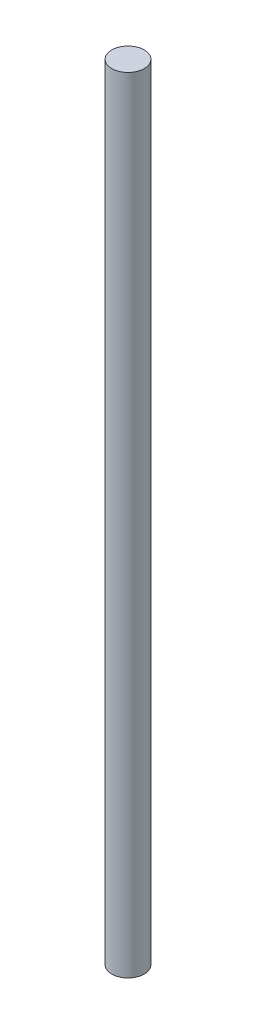
ISO-10303-21;
HEADER;
FILE_DESCRIPTION(('STEP AP214'),'2;1');
FILE_NAME('part.step','',(''),(''),'','','');
FILE_SCHEMA(('AUTOMOTIVE_DESIGN { 1 0 10303 214 1 1 1 1 }'));
ENDSEC;
DATA;
#1=APPLICATION_CONTEXT('core data for automotive mechanical design processes');
#2=APPLICATION_PROTOCOL_DEFINITION('international standard','automotive_design',2000,#1);
#3=PRODUCT_CONTEXT('',#1,'mechanical');
#4=PRODUCT('Part','Part','',(#3));
#5=PRODUCT_RELATED_PRODUCT_CATEGORY('part','',(#4));
#6=PRODUCT_DEFINITION_FORMATION('','',#4);
#7=PRODUCT_DEFINITION_CONTEXT('part definition',#1,'design');
#8=PRODUCT_DEFINITION('design','',#6,#7);
#9=PRODUCT_DEFINITION_SHAPE('','',#8);
#10=(LENGTH_UNIT() NAMED_UNIT(*) SI_UNIT(.MILLI.,.METRE.));
#11=(NAMED_UNIT(*) PLANE_ANGLE_UNIT() SI_UNIT($,.RADIAN.));
#12=(NAMED_UNIT(*) SI_UNIT($,.STERADIAN.) SOLID_ANGLE_UNIT());
#13=UNCERTAINTY_MEASURE_WITH_UNIT(LENGTH_MEASURE(1.E-05),#10,'distance_accuracy_value','');
#14=(GEOMETRIC_REPRESENTATION_CONTEXT(3) GLOBAL_UNCERTAINTY_ASSIGNED_CONTEXT((#13)) GLOBAL_UNIT_ASSIGNED_CONTEXT((#10,
#11,#12)) REPRESENTATION_CONTEXT('',''));
#15=CARTESIAN_POINT('',(0.,0.,0.));
#16=DIRECTION('',(0.,0.,1.));
#17=DIRECTION('',(1.,0.,0.));
#18=AXIS2_PLACEMENT_3D('',#15,#16,#17);
#19=CARTESIAN_POINT('',(0.,121.,0.));
#20=DIRECTION('',(0.,-1.,0.));
#21=DIRECTION('',(0.,0.,-1.));
#22=AXIS2_PLACEMENT_3D('',#19,#20,#21);
#23=CYLINDRICAL_SURFACE('',#22,2.5);
#24=CARTESIAN_POINT('',(0.,121.,0.));
#25=DIRECTION('',(0.,1.,0.));
#26=DIRECTION('',(0.,0.,1.));
#27=AXIS2_PLACEMENT_3D('',#24,#25,#26);
#28=CIRCLE('',#27,2.5);
#29=CARTESIAN_POINT('',(0.,121.,2.5));
#30=VERTEX_POINT('',#29);
#31=EDGE_CURVE('E10',#30,#30,#28,.T.);
#32=ORIENTED_EDGE('',*,*,#31,.F.);
#33=EDGE_LOOP('',(#32));
#34=FACE_BOUND('',#33,.T.);
#35=CARTESIAN_POINT('',(0.,0.,0.));
#36=DIRECTION('',(0.,1.,0.));
#37=DIRECTION('',(0.,0.,1.));
#38=AXIS2_PLACEMENT_3D('',#35,#36,#37);
#39=CIRCLE('',#38,2.5);
#40=CARTESIAN_POINT('',(0.,0.,2.5));
#41=VERTEX_POINT('',#40);
#42=EDGE_CURVE('E40',#41,#41,#39,.T.);
#43=ORIENTED_EDGE('',*,*,#42,.T.);
#44=EDGE_LOOP('',(#43));
#45=FACE_BOUND('',#44,.T.);
#46=ADVANCED_FACE('F37',(#34,#45),#23,.T.);
#47=CARTESIAN_POINT('',(0.,121.,0.));
#48=DIRECTION('',(0.,1.,0.));
#49=DIRECTION('',(0.,0.,1.));
#50=AXIS2_PLACEMENT_3D('',#47,#48,#49);
#51=PLANE('',#50);
#52=ORIENTED_EDGE('',*,*,#31,.T.);
#53=EDGE_LOOP('',(#52));
#54=FACE_BOUND('',#53,.T.);
#55=ADVANCED_FACE('F54',(#54),#51,.T.);
#56=CARTESIAN_POINT('',(0.,0.,0.));
#57=DIRECTION('',(0.,1.,0.));
#58=DIRECTION('',(0.,0.,1.));
#59=AXIS2_PLACEMENT_3D('',#56,#57,#58);
#60=PLANE('',#59);
#61=ORIENTED_EDGE('',*,*,#42,.F.);
#62=EDGE_LOOP('',(#61));
#63=FACE_BOUND('',#62,.T.);
#64=ADVANCED_FACE('F52',(#63),#60,.F.);
#65=CLOSED_SHELL('',(#46,#55,#64));
#66=MANIFOLD_SOLID_BREP('B2',#65);
#67=ADVANCED_BREP_SHAPE_REPRESENTATION('',(#18,#66),#14);
#68=SHAPE_DEFINITION_REPRESENTATION(#9,#67);
ENDSEC;
END-ISO-10303-21;
